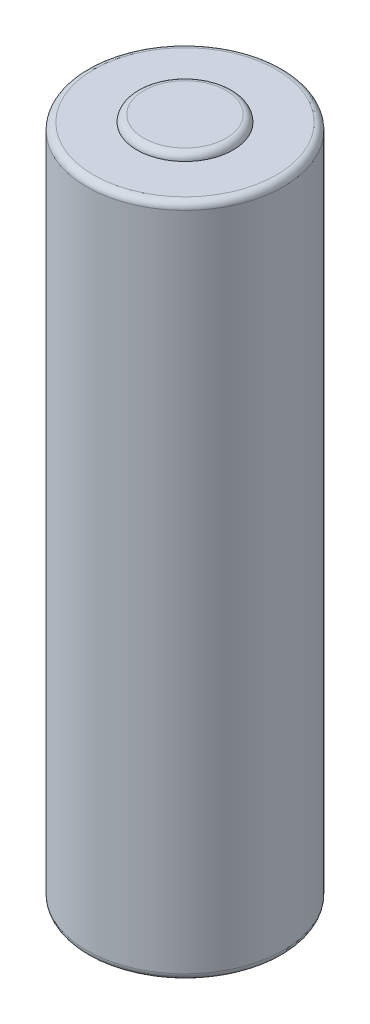
ISO-10303-21;
HEADER;
FILE_DESCRIPTION(('STEP AP214'),'2;1');
FILE_NAME('part.step','',(''),(''),'','','');
FILE_SCHEMA(('AUTOMOTIVE_DESIGN { 1 0 10303 214 1 1 1 1 }'));
ENDSEC;
DATA;
#1=APPLICATION_CONTEXT('core data for automotive mechanical design processes');
#2=APPLICATION_PROTOCOL_DEFINITION('international standard','automotive_design',2000,#1);
#3=PRODUCT_CONTEXT('',#1,'mechanical');
#4=PRODUCT('Part','Part','',(#3));
#5=PRODUCT_RELATED_PRODUCT_CATEGORY('part','',(#4));
#6=PRODUCT_DEFINITION_FORMATION('','',#4);
#7=PRODUCT_DEFINITION_CONTEXT('part definition',#1,'design');
#8=PRODUCT_DEFINITION('design','',#6,#7);
#9=PRODUCT_DEFINITION_SHAPE('','',#8);
#10=(LENGTH_UNIT() NAMED_UNIT(*) SI_UNIT(.MILLI.,.METRE.));
#11=(NAMED_UNIT(*) PLANE_ANGLE_UNIT() SI_UNIT($,.RADIAN.));
#12=(NAMED_UNIT(*) SI_UNIT($,.STERADIAN.) SOLID_ANGLE_UNIT());
#13=UNCERTAINTY_MEASURE_WITH_UNIT(LENGTH_MEASURE(1.E-05),#10,'distance_accuracy_value','');
#14=(GEOMETRIC_REPRESENTATION_CONTEXT(3) GLOBAL_UNCERTAINTY_ASSIGNED_CONTEXT((#13)) GLOBAL_UNIT_ASSIGNED_CONTEXT((#10,
#11,#12)) REPRESENTATION_CONTEXT('',''));
#15=CARTESIAN_POINT('',(0.,0.,0.));
#16=DIRECTION('',(0.,0.,1.));
#17=DIRECTION('',(1.,0.,0.));
#18=AXIS2_PLACEMENT_3D('',#15,#16,#17);
#19=CARTESIAN_POINT('',(0.,24.5635,0.));
#20=DIRECTION('',(0.,1.,0.));
#21=DIRECTION('',(0.,0.,1.));
#22=AXIS2_PLACEMENT_3D('',#19,#20,#21);
#23=PLANE('',#22);
#24=CARTESIAN_POINT('',(0.,24.5635,0.));
#25=DIRECTION('',(0.,1.,0.));
#26=DIRECTION('',(0.,0.,1.));
#27=AXIS2_PLACEMENT_3D('',#24,#25,#26);
#28=CIRCLE('',#27,6.65);
#29=CARTESIAN_POINT('',(0.,24.5635,6.65));
#30=VERTEX_POINT('',#29);
#31=EDGE_CURVE('E10',#30,#30,#28,.T.);
#32=ORIENTED_EDGE('',*,*,#31,.T.);
#33=EDGE_LOOP('',(#32));
#34=FACE_BOUND('',#33,.T.);
#35=CARTESIAN_POINT('',(0.,24.5635,0.));
#36=DIRECTION('',(0.,1.,0.));
#37=DIRECTION('',(0.,0.,1.));
#38=AXIS2_PLACEMENT_3D('',#35,#36,#37);
#39=CIRCLE('',#38,3.5);
#40=CARTESIAN_POINT('',(0.,24.5635,3.5));
#41=VERTEX_POINT('',#40);
#42=EDGE_CURVE('E58',#41,#41,#39,.T.);
#43=ORIENTED_EDGE('',*,*,#42,.F.);
#44=EDGE_LOOP('',(#43));
#45=FACE_BOUND('',#44,.T.);
#46=ADVANCED_FACE('F35',(#34,#45),#23,.T.);
#47=CARTESIAN_POINT('',(0.,24.5635,0.));
#48=DIRECTION('',(0.,-1.,0.));
#49=DIRECTION('',(0.,0.,-1.));
#50=AXIS2_PLACEMENT_3D('',#47,#48,#49);
#51=CYLINDRICAL_SURFACE('',#50,7.15);
#52=CARTESIAN_POINT('',(0.,-24.0635,0.));
#53=DIRECTION('',(0.,1.,0.));
#54=DIRECTION('',(0.,0.,1.));
#55=AXIS2_PLACEMENT_3D('',#52,#53,#54);
#56=CIRCLE('',#55,7.15);
#57=CARTESIAN_POINT('',(0.,-24.0635,7.15));
#58=VERTEX_POINT('',#57);
#59=EDGE_CURVE('E46',#58,#58,#56,.T.);
#60=ORIENTED_EDGE('',*,*,#59,.T.);
#61=EDGE_LOOP('',(#60));
#62=FACE_BOUND('',#61,.T.);
#63=CARTESIAN_POINT('',(0.,24.0635,0.));
#64=DIRECTION('',(0.,1.,0.));
#65=DIRECTION('',(0.,0.,1.));
#66=AXIS2_PLACEMENT_3D('',#63,#64,#65);
#67=CIRCLE('',#66,7.15);
#68=CARTESIAN_POINT('',(0.,24.0635,7.15));
#69=VERTEX_POINT('',#68);
#70=EDGE_CURVE('E50',#69,#69,#67,.F.);
#71=ORIENTED_EDGE('',*,*,#70,.T.);
#72=EDGE_LOOP('',(#71));
#73=FACE_BOUND('',#72,.T.);
#74=ADVANCED_FACE('F66',(#62,#73),#51,.T.);
#75=CARTESIAN_POINT('',(0.,-24.5635,0.));
#76=DIRECTION('',(0.,1.,0.));
#77=DIRECTION('',(0.,0.,1.));
#78=AXIS2_PLACEMENT_3D('',#75,#76,#77);
#79=PLANE('',#78);
#80=CARTESIAN_POINT('',(0.,-24.5635,0.));
#81=DIRECTION('',(0.,1.,0.));
#82=DIRECTION('',(0.,0.,1.));
#83=AXIS2_PLACEMENT_3D('',#80,#81,#82);
#84=CIRCLE('',#83,6.65);
#85=CARTESIAN_POINT('',(0.,-24.5635,6.65));
#86=VERTEX_POINT('',#85);
#87=EDGE_CURVE('E42',#86,#86,#84,.F.);
#88=ORIENTED_EDGE('',*,*,#87,.T.);
#89=EDGE_LOOP('',(#88));
#90=FACE_BOUND('',#89,.T.);
#91=ADVANCED_FACE('F71',(#90),#79,.F.);
#92=CARTESIAN_POINT('',(0.,25.0635,0.));
#93=DIRECTION('',(0.,1.,0.));
#94=DIRECTION('',(0.,0.,1.));
#95=AXIS2_PLACEMENT_3D('',#92,#93,#94);
#96=PLANE('',#95);
#97=CARTESIAN_POINT('',(0.,25.0635,0.));
#98=DIRECTION('',(0.,1.,0.));
#99=DIRECTION('',(0.,0.,1.));
#100=AXIS2_PLACEMENT_3D('',#97,#98,#99);
#101=CIRCLE('',#100,3.);
#102=CARTESIAN_POINT('',(0.,25.0635,3.));
#103=VERTEX_POINT('',#102);
#104=EDGE_CURVE('E55',#103,#103,#101,.T.);
#105=ORIENTED_EDGE('',*,*,#104,.T.);
#106=EDGE_LOOP('',(#105));
#107=FACE_BOUND('',#106,.T.);
#108=ADVANCED_FACE('F76',(#107),#96,.T.);
#109=CARTESIAN_POINT('',(0.,24.5635,0.));
#110=DIRECTION('',(0.,1.,0.));
#111=DIRECTION('',(0.,0.,1.));
#112=AXIS2_PLACEMENT_3D('',#109,#110,#111);
#113=TOROIDAL_SURFACE('',#112,3.,0.5);
#114=ORIENTED_EDGE('',*,*,#42,.T.);
#115=EDGE_LOOP('',(#114));
#116=FACE_BOUND('',#115,.T.);
#117=ORIENTED_EDGE('',*,*,#104,.F.);
#118=EDGE_LOOP('',(#117));
#119=FACE_BOUND('',#118,.T.);
#120=ADVANCED_FACE('F62',(#116,#119),#113,.T.);
#121=CARTESIAN_POINT('',(0.,-24.0635,0.));
#122=DIRECTION('',(0.,1.,0.));
#123=DIRECTION('',(0.,0.,1.));
#124=AXIS2_PLACEMENT_3D('',#121,#122,#123);
#125=TOROIDAL_SURFACE('',#124,6.65,0.5);
#126=ORIENTED_EDGE('',*,*,#87,.F.);
#127=EDGE_LOOP('',(#126));
#128=FACE_BOUND('',#127,.T.);
#129=ORIENTED_EDGE('',*,*,#59,.F.);
#130=EDGE_LOOP('',(#129));
#131=FACE_BOUND('',#130,.T.);
#132=ADVANCED_FACE('F80',(#128,#131),#125,.T.);
#133=CARTESIAN_POINT('',(0.,24.0635,0.));
#134=DIRECTION('',(0.,1.,0.));
#135=DIRECTION('',(0.,0.,1.));
#136=AXIS2_PLACEMENT_3D('',#133,#134,#135);
#137=TOROIDAL_SURFACE('',#136,6.65,0.5);
#138=ORIENTED_EDGE('',*,*,#70,.F.);
#139=EDGE_LOOP('',(#138));
#140=FACE_BOUND('',#139,.T.);
#141=ORIENTED_EDGE('',*,*,#31,.F.);
#142=EDGE_LOOP('',(#141));
#143=FACE_BOUND('',#142,.T.);
#144=ADVANCED_FACE('F37',(#140,#143),#137,.T.);
#145=CLOSED_SHELL('',(#46,#74,#91,#108,#120,#132,#144));
#146=MANIFOLD_SOLID_BREP('B2',#145);
#147=ADVANCED_BREP_SHAPE_REPRESENTATION('',(#18,#146),#14);
#148=SHAPE_DEFINITION_REPRESENTATION(#9,#147);
ENDSEC;
END-ISO-10303-21;
